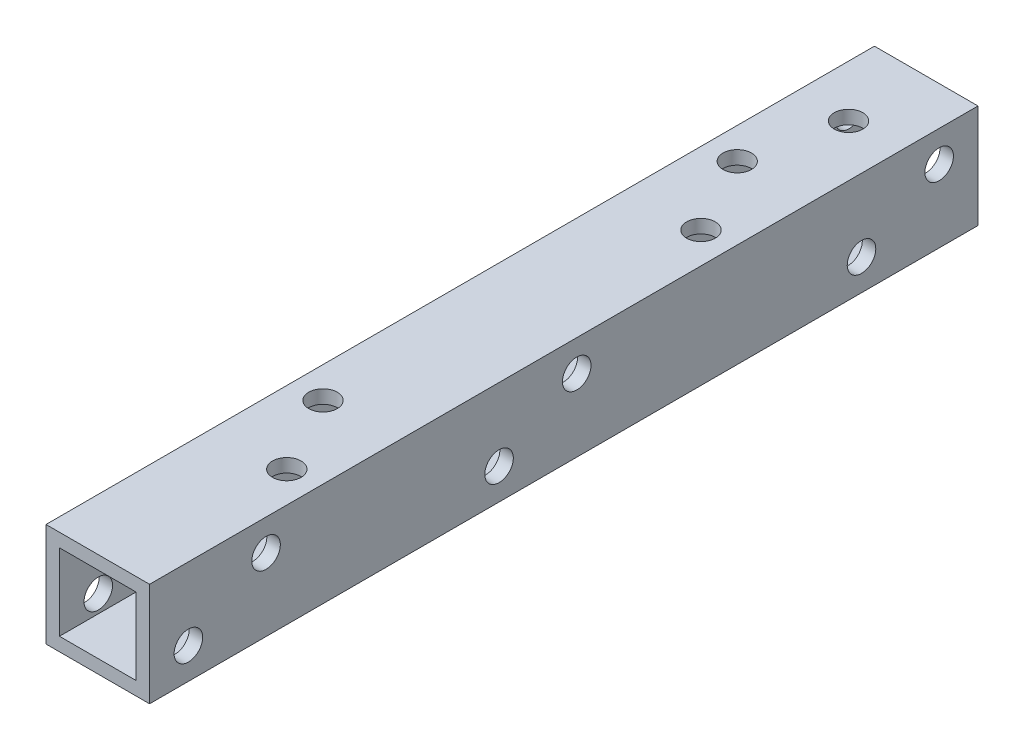
ISO-10303-21;
HEADER;
FILE_DESCRIPTION(('STEP AP214'),'2;1');
FILE_NAME('part.step','',(''),(''),'','','');
FILE_SCHEMA(('AUTOMOTIVE_DESIGN { 1 0 10303 214 1 1 1 1 }'));
ENDSEC;
DATA;
#1=APPLICATION_CONTEXT('core data for automotive mechanical design processes');
#2=APPLICATION_PROTOCOL_DEFINITION('international standard','automotive_design',2000,#1);
#3=PRODUCT_CONTEXT('',#1,'mechanical');
#4=PRODUCT('Part','Part','',(#3));
#5=PRODUCT_RELATED_PRODUCT_CATEGORY('part','',(#4));
#6=PRODUCT_DEFINITION_FORMATION('','',#4);
#7=PRODUCT_DEFINITION_CONTEXT('part definition',#1,'design');
#8=PRODUCT_DEFINITION('design','',#6,#7);
#9=PRODUCT_DEFINITION_SHAPE('','',#8);
#10=(LENGTH_UNIT() NAMED_UNIT(*) SI_UNIT(.MILLI.,.METRE.));
#11=(NAMED_UNIT(*) PLANE_ANGLE_UNIT() SI_UNIT($,.RADIAN.));
#12=(NAMED_UNIT(*) SI_UNIT($,.STERADIAN.) SOLID_ANGLE_UNIT());
#13=UNCERTAINTY_MEASURE_WITH_UNIT(LENGTH_MEASURE(1.E-05),#10,'distance_accuracy_value','');
#14=(GEOMETRIC_REPRESENTATION_CONTEXT(3) GLOBAL_UNCERTAINTY_ASSIGNED_CONTEXT((#13)) GLOBAL_UNIT_ASSIGNED_CONTEXT((#10,
#11,#12)) REPRESENTATION_CONTEXT('',''));
#15=CARTESIAN_POINT('',(0.,0.,0.));
#16=DIRECTION('',(0.,0.,1.));
#17=DIRECTION('',(1.,0.,0.));
#18=AXIS2_PLACEMENT_3D('',#15,#16,#17);
#19=CARTESIAN_POINT('',(0.,0.,101.6));
#20=DIRECTION('',(0.,0.,1.));
#21=DIRECTION('',(1.,0.,0.));
#22=AXIS2_PLACEMENT_3D('',#19,#20,#21);
#23=PLANE('',#22);
#24=DIRECTION('',(1.,0.,0.));
#25=VECTOR('',#24,1.);
#26=CARTESIAN_POINT('',(6.35,-6.35,101.6));
#27=LINE('',#26,#25);
#28=CARTESIAN_POINT('',(-6.35,-6.35,101.6));
#29=VERTEX_POINT('',#28);
#30=CARTESIAN_POINT('',(6.35,-6.35,101.6));
#31=VERTEX_POINT('',#30);
#32=EDGE_CURVE('E146',#29,#31,#27,.T.);
#33=ORIENTED_EDGE('',*,*,#32,.T.);
#34=DIRECTION('',(0.,1.,0.));
#35=VECTOR('',#34,1.);
#36=CARTESIAN_POINT('',(6.35,6.35,101.6));
#37=LINE('',#36,#35);
#38=CARTESIAN_POINT('',(6.35,6.35,101.6));
#39=VERTEX_POINT('',#38);
#40=EDGE_CURVE('E149',#31,#39,#37,.T.);
#41=ORIENTED_EDGE('',*,*,#40,.T.);
#42=DIRECTION('',(-1.,0.,0.));
#43=VECTOR('',#42,1.);
#44=CARTESIAN_POINT('',(6.35,6.35,101.6));
#45=LINE('',#44,#43);
#46=CARTESIAN_POINT('',(-6.35,6.35,101.6));
#47=VERTEX_POINT('',#46);
#48=EDGE_CURVE('E152',#39,#47,#45,.T.);
#49=ORIENTED_EDGE('',*,*,#48,.T.);
#50=DIRECTION('',(0.,-1.,0.));
#51=VECTOR('',#50,1.);
#52=CARTESIAN_POINT('',(-6.35,6.35,101.6));
#53=LINE('',#52,#51);
#54=EDGE_CURVE('E154',#47,#29,#53,.T.);
#55=ORIENTED_EDGE('',*,*,#54,.T.);
#56=EDGE_LOOP('',(#33,#41,#49,#55));
#57=FACE_BOUND('',#56,.T.);
#58=DIRECTION('',(0.,1.,0.));
#59=VECTOR('',#58,1.);
#60=CARTESIAN_POINT('',(4.699,4.699,101.6));
#61=LINE('',#60,#59);
#62=CARTESIAN_POINT('',(4.699,-4.699,101.6));
#63=VERTEX_POINT('',#62);
#64=CARTESIAN_POINT('',(4.699,4.699,101.6));
#65=VERTEX_POINT('',#64);
#66=EDGE_CURVE('E116',#63,#65,#61,.T.);
#67=ORIENTED_EDGE('',*,*,#66,.F.);
#68=DIRECTION('',(1.,0.,0.));
#69=VECTOR('',#68,1.);
#70=CARTESIAN_POINT('',(4.699,-4.699,101.6));
#71=LINE('',#70,#69);
#72=CARTESIAN_POINT('',(-4.699,-4.699,101.6));
#73=VERTEX_POINT('',#72);
#74=EDGE_CURVE('E108',#73,#63,#71,.T.);
#75=ORIENTED_EDGE('',*,*,#74,.F.);
#76=DIRECTION('',(0.,-1.,0.));
#77=VECTOR('',#76,1.);
#78=CARTESIAN_POINT('',(-4.699,4.699,101.6));
#79=LINE('',#78,#77);
#80=CARTESIAN_POINT('',(-4.699,4.699,101.6));
#81=VERTEX_POINT('',#80);
#82=EDGE_CURVE('E130',#81,#73,#79,.T.);
#83=ORIENTED_EDGE('',*,*,#82,.F.);
#84=DIRECTION('',(-1.,0.,0.));
#85=VECTOR('',#84,1.);
#86=CARTESIAN_POINT('',(4.699,4.699,101.6));
#87=LINE('',#86,#85);
#88=EDGE_CURVE('E128',#65,#81,#87,.T.);
#89=ORIENTED_EDGE('',*,*,#88,.F.);
#90=EDGE_LOOP('',(#67,#75,#83,#89));
#91=FACE_BOUND('',#90,.T.);
#92=ADVANCED_FACE('F41',(#57,#91),#23,.T.);
#93=CARTESIAN_POINT('',(0.,0.,0.));
#94=DIRECTION('',(0.,0.,1.));
#95=DIRECTION('',(1.,0.,0.));
#96=AXIS2_PLACEMENT_3D('',#93,#94,#95);
#97=PLANE('',#96);
#98=DIRECTION('',(1.,0.,0.));
#99=VECTOR('',#98,1.);
#100=CARTESIAN_POINT('',(6.35,-6.35,0.));
#101=LINE('',#100,#99);
#102=CARTESIAN_POINT('',(-6.35,-6.35,0.));
#103=VERTEX_POINT('',#102);
#104=CARTESIAN_POINT('',(6.35,-6.35,0.));
#105=VERTEX_POINT('',#104);
#106=EDGE_CURVE('E124',#103,#105,#101,.T.);
#107=ORIENTED_EDGE('',*,*,#106,.F.);
#108=DIRECTION('',(0.,-1.,0.));
#109=VECTOR('',#108,1.);
#110=CARTESIAN_POINT('',(-6.35,6.35,0.));
#111=LINE('',#110,#109);
#112=CARTESIAN_POINT('',(-6.35,6.35,0.));
#113=VERTEX_POINT('',#112);
#114=EDGE_CURVE('E150',#113,#103,#111,.T.);
#115=ORIENTED_EDGE('',*,*,#114,.F.);
#116=DIRECTION('',(-1.,0.,0.));
#117=VECTOR('',#116,1.);
#118=CARTESIAN_POINT('',(6.35,6.35,0.));
#119=LINE('',#118,#117);
#120=CARTESIAN_POINT('',(6.35,6.35,0.));
#121=VERTEX_POINT('',#120);
#122=EDGE_CURVE('E161',#121,#113,#119,.T.);
#123=ORIENTED_EDGE('',*,*,#122,.F.);
#124=DIRECTION('',(0.,1.,0.));
#125=VECTOR('',#124,1.);
#126=CARTESIAN_POINT('',(6.35,6.35,0.));
#127=LINE('',#126,#125);
#128=EDGE_CURVE('E159',#105,#121,#127,.T.);
#129=ORIENTED_EDGE('',*,*,#128,.F.);
#130=EDGE_LOOP('',(#107,#115,#123,#129));
#131=FACE_BOUND('',#130,.T.);
#132=DIRECTION('',(1.,0.,0.));
#133=VECTOR('',#132,1.);
#134=CARTESIAN_POINT('',(4.699,-4.699,0.));
#135=LINE('',#134,#133);
#136=CARTESIAN_POINT('',(-4.699,-4.699,0.));
#137=VERTEX_POINT('',#136);
#138=CARTESIAN_POINT('',(4.699,-4.699,0.));
#139=VERTEX_POINT('',#138);
#140=EDGE_CURVE('E66',#137,#139,#135,.T.);
#141=ORIENTED_EDGE('',*,*,#140,.T.);
#142=DIRECTION('',(0.,1.,0.));
#143=VECTOR('',#142,1.);
#144=CARTESIAN_POINT('',(4.699,4.699,0.));
#145=LINE('',#144,#143);
#146=CARTESIAN_POINT('',(4.699,4.699,0.));
#147=VERTEX_POINT('',#146);
#148=EDGE_CURVE('E123',#139,#147,#145,.T.);
#149=ORIENTED_EDGE('',*,*,#148,.T.);
#150=DIRECTION('',(-1.,0.,0.));
#151=VECTOR('',#150,1.);
#152=CARTESIAN_POINT('',(4.699,4.699,0.));
#153=LINE('',#152,#151);
#154=CARTESIAN_POINT('',(-4.699,4.699,0.));
#155=VERTEX_POINT('',#154);
#156=EDGE_CURVE('E138',#147,#155,#153,.T.);
#157=ORIENTED_EDGE('',*,*,#156,.T.);
#158=DIRECTION('',(0.,-1.,0.));
#159=VECTOR('',#158,1.);
#160=CARTESIAN_POINT('',(-4.699,4.699,0.));
#161=LINE('',#160,#159);
#162=EDGE_CURVE('E117',#155,#137,#161,.T.);
#163=ORIENTED_EDGE('',*,*,#162,.T.);
#164=EDGE_LOOP('',(#141,#149,#157,#163));
#165=FACE_BOUND('',#164,.T.);
#166=ADVANCED_FACE('F288',(#131,#165),#97,.F.);
#167=CARTESIAN_POINT('',(6.35,-6.35,101.6));
#168=DIRECTION('',(0.,1.,0.));
#169=DIRECTION('',(0.,0.,1.));
#170=AXIS2_PLACEMENT_3D('',#167,#168,#169);
#171=PLANE('',#170);
#172=CARTESIAN_POINT('',(0.,-6.35,9.52500000000001));
#173=DIRECTION('',(0.,1.,0.));
#174=DIRECTION('',(0.,0.,1.));
#175=AXIS2_PLACEMENT_3D('',#172,#173,#174);
#176=CIRCLE('',#175,1.75);
#177=CARTESIAN_POINT('',(0.,-6.35,11.275));
#178=VERTEX_POINT('',#177);
#179=EDGE_CURVE('E438',#178,#178,#176,.T.);
#180=ORIENTED_EDGE('',*,*,#179,.T.);
#181=EDGE_LOOP('',(#180));
#182=FACE_BOUND('',#181,.T.);
#183=CARTESIAN_POINT('',(-2.54,-6.35,20.6375));
#184=DIRECTION('',(0.,1.,0.));
#185=DIRECTION('',(0.,0.,1.));
#186=AXIS2_PLACEMENT_3D('',#183,#184,#185);
#187=CIRCLE('',#186,1.75);
#188=CARTESIAN_POINT('',(-2.54,-6.35,22.3875));
#189=VERTEX_POINT('',#188);
#190=EDGE_CURVE('E136',#189,#189,#187,.T.);
#191=ORIENTED_EDGE('',*,*,#190,.T.);
#192=EDGE_LOOP('',(#191));
#193=FACE_BOUND('',#192,.T.);
#194=CARTESIAN_POINT('',(2.54,-6.35,80.9625));
#195=DIRECTION('',(0.,1.,0.));
#196=DIRECTION('',(0.,0.,1.));
#197=AXIS2_PLACEMENT_3D('',#194,#195,#196);
#198=CIRCLE('',#197,1.75);
#199=CARTESIAN_POINT('',(2.54,-6.35,82.7125));
#200=VERTEX_POINT('',#199);
#201=EDGE_CURVE('E190',#200,#200,#198,.T.);
#202=ORIENTED_EDGE('',*,*,#201,.T.);
#203=EDGE_LOOP('',(#202));
#204=FACE_BOUND('',#203,.T.);
#205=CARTESIAN_POINT('',(-2.54,-6.35,71.4375));
#206=DIRECTION('',(0.,1.,0.));
#207=DIRECTION('',(0.,0.,1.));
#208=AXIS2_PLACEMENT_3D('',#205,#206,#207);
#209=CIRCLE('',#208,1.75000000000001);
#210=CARTESIAN_POINT('',(-2.54,-6.35,73.1875));
#211=VERTEX_POINT('',#210);
#212=EDGE_CURVE('E185',#211,#211,#209,.T.);
#213=ORIENTED_EDGE('',*,*,#212,.T.);
#214=EDGE_LOOP('',(#213));
#215=FACE_BOUND('',#214,.T.);
#216=CARTESIAN_POINT('',(2.54,-6.35,30.1625));
#217=DIRECTION('',(0.,1.,0.));
#218=DIRECTION('',(0.,0.,1.));
#219=AXIS2_PLACEMENT_3D('',#216,#217,#218);
#220=CIRCLE('',#219,1.75);
#221=CARTESIAN_POINT('',(2.54,-6.35,31.9125));
#222=VERTEX_POINT('',#221);
#223=EDGE_CURVE('E180',#222,#222,#220,.T.);
#224=ORIENTED_EDGE('',*,*,#223,.T.);
#225=EDGE_LOOP('',(#224));
#226=FACE_BOUND('',#225,.T.);
#227=ORIENTED_EDGE('',*,*,#106,.T.);
#228=DIRECTION('',(0.,0.,-1.));
#229=VECTOR('',#228,1.);
#230=CARTESIAN_POINT('',(6.35,-6.35,101.6));
#231=LINE('',#230,#229);
#232=EDGE_CURVE('E11',#31,#105,#231,.T.);
#233=ORIENTED_EDGE('',*,*,#232,.F.);
#234=ORIENTED_EDGE('',*,*,#32,.F.);
#235=DIRECTION('',(0.,0.,-1.));
#236=VECTOR('',#235,1.);
#237=CARTESIAN_POINT('',(-6.35,-6.35,101.6));
#238=LINE('',#237,#236);
#239=EDGE_CURVE('E156',#29,#103,#238,.T.);
#240=ORIENTED_EDGE('',*,*,#239,.T.);
#241=EDGE_LOOP('',(#227,#233,#234,#240));
#242=FACE_BOUND('',#241,.T.);
#243=ADVANCED_FACE('F43',(#182,#193,#204,#215,#226,#242),#171,.F.);
#244=CARTESIAN_POINT('',(6.35,6.35,101.6));
#245=DIRECTION('',(-1.,0.,0.));
#246=DIRECTION('',(0.,-1.,0.));
#247=AXIS2_PLACEMENT_3D('',#244,#245,#246);
#248=PLANE('',#247);
#249=CARTESIAN_POINT('',(6.35,-2.54,96.8375));
#250=DIRECTION('',(1.,0.,0.));
#251=DIRECTION('',(0.,1.,0.));
#252=AXIS2_PLACEMENT_3D('',#249,#250,#251);
#253=CIRCLE('',#252,1.75000000000001);
#254=CARTESIAN_POINT('',(6.35,-0.789999999999993,96.8375));
#255=VERTEX_POINT('',#254);
#256=EDGE_CURVE('E195',#255,#255,#253,.T.);
#257=ORIENTED_EDGE('',*,*,#256,.F.);
#258=EDGE_LOOP('',(#257));
#259=FACE_BOUND('',#258,.T.);
#260=CARTESIAN_POINT('',(6.35,2.54000000000001,49.2125));
#261=DIRECTION('',(1.,0.,0.));
#262=DIRECTION('',(0.,1.,0.));
#263=AXIS2_PLACEMENT_3D('',#260,#261,#262);
#264=CIRCLE('',#263,1.75000000000001);
#265=CARTESIAN_POINT('',(6.35,4.29000000000001,49.2125));
#266=VERTEX_POINT('',#265);
#267=EDGE_CURVE('E318',#266,#266,#264,.T.);
#268=ORIENTED_EDGE('',*,*,#267,.F.);
#269=EDGE_LOOP('',(#268));
#270=FACE_BOUND('',#269,.T.);
#271=CARTESIAN_POINT('',(6.35,2.54,87.3125));
#272=DIRECTION('',(1.,0.,0.));
#273=DIRECTION('',(0.,1.,0.));
#274=AXIS2_PLACEMENT_3D('',#271,#272,#273);
#275=CIRCLE('',#274,1.75000000000001);
#276=CARTESIAN_POINT('',(6.35,4.29000000000001,87.3125));
#277=VERTEX_POINT('',#276);
#278=EDGE_CURVE('E322',#277,#277,#275,.T.);
#279=ORIENTED_EDGE('',*,*,#278,.F.);
#280=EDGE_LOOP('',(#279));
#281=FACE_BOUND('',#280,.T.);
#282=CARTESIAN_POINT('',(6.35,-2.54,14.2875));
#283=DIRECTION('',(1.,0.,0.));
#284=DIRECTION('',(0.,1.,0.));
#285=AXIS2_PLACEMENT_3D('',#282,#283,#284);
#286=CIRCLE('',#285,1.75000000000001);
#287=CARTESIAN_POINT('',(6.35,-0.789999999999996,14.2875));
#288=VERTEX_POINT('',#287);
#289=EDGE_CURVE('E326',#288,#288,#286,.T.);
#290=ORIENTED_EDGE('',*,*,#289,.F.);
#291=EDGE_LOOP('',(#290));
#292=FACE_BOUND('',#291,.T.);
#293=CARTESIAN_POINT('',(6.35,2.54,4.76250000000001));
#294=DIRECTION('',(1.,0.,0.));
#295=DIRECTION('',(0.,1.,0.));
#296=AXIS2_PLACEMENT_3D('',#293,#294,#295);
#297=CIRCLE('',#296,1.75000000000001);
#298=CARTESIAN_POINT('',(6.35,4.29,4.76250000000001));
#299=VERTEX_POINT('',#298);
#300=EDGE_CURVE('E330',#299,#299,#297,.T.);
#301=ORIENTED_EDGE('',*,*,#300,.F.);
#302=EDGE_LOOP('',(#301));
#303=FACE_BOUND('',#302,.T.);
#304=CARTESIAN_POINT('',(6.35,-2.53999999999999,58.7375));
#305=DIRECTION('',(1.,0.,0.));
#306=DIRECTION('',(0.,1.,0.));
#307=AXIS2_PLACEMENT_3D('',#304,#305,#306);
#308=CIRCLE('',#307,1.75000000000001);
#309=CARTESIAN_POINT('',(6.35,-0.789999999999989,58.7375));
#310=VERTEX_POINT('',#309);
#311=EDGE_CURVE('E334',#310,#310,#308,.T.);
#312=ORIENTED_EDGE('',*,*,#311,.F.);
#313=EDGE_LOOP('',(#312));
#314=FACE_BOUND('',#313,.T.);
#315=ORIENTED_EDGE('',*,*,#128,.T.);
#316=DIRECTION('',(0.,0.,-1.));
#317=VECTOR('',#316,1.);
#318=CARTESIAN_POINT('',(6.35,6.35,101.6));
#319=LINE('',#318,#317);
#320=EDGE_CURVE('E50',#39,#121,#319,.T.);
#321=ORIENTED_EDGE('',*,*,#320,.F.);
#322=ORIENTED_EDGE('',*,*,#40,.F.);
#323=ORIENTED_EDGE('',*,*,#232,.T.);
#324=EDGE_LOOP('',(#315,#321,#322,#323));
#325=FACE_BOUND('',#324,.T.);
#326=ADVANCED_FACE('F305',(#259,#270,#281,#292,#303,#314,#325),#248,.F.);
#327=CARTESIAN_POINT('',(6.35,6.35,101.6));
#328=DIRECTION('',(0.,-1.,0.));
#329=DIRECTION('',(0.,0.,-1.));
#330=AXIS2_PLACEMENT_3D('',#327,#328,#329);
#331=PLANE('',#330);
#332=CARTESIAN_POINT('',(0.,6.35,9.52500000000001));
#333=DIRECTION('',(0.,1.,0.));
#334=DIRECTION('',(0.,0.,1.));
#335=AXIS2_PLACEMENT_3D('',#332,#333,#334);
#336=CIRCLE('',#335,1.75);
#337=CARTESIAN_POINT('',(0.,6.35,11.275));
#338=VERTEX_POINT('',#337);
#339=EDGE_CURVE('E445',#338,#338,#336,.T.);
#340=ORIENTED_EDGE('',*,*,#339,.F.);
#341=EDGE_LOOP('',(#340));
#342=FACE_BOUND('',#341,.T.);
#343=CARTESIAN_POINT('',(-2.54,6.35,20.6375));
#344=DIRECTION('',(0.,1.,0.));
#345=DIRECTION('',(0.,0.,1.));
#346=AXIS2_PLACEMENT_3D('',#343,#344,#345);
#347=CIRCLE('',#346,1.75);
#348=CARTESIAN_POINT('',(-2.54,6.35,22.3875));
#349=VERTEX_POINT('',#348);
#350=EDGE_CURVE('E238',#349,#349,#347,.T.);
#351=ORIENTED_EDGE('',*,*,#350,.F.);
#352=EDGE_LOOP('',(#351));
#353=FACE_BOUND('',#352,.T.);
#354=CARTESIAN_POINT('',(2.54,6.35,80.9625));
#355=DIRECTION('',(0.,1.,0.));
#356=DIRECTION('',(0.,0.,1.));
#357=AXIS2_PLACEMENT_3D('',#354,#355,#356);
#358=CIRCLE('',#357,1.75);
#359=CARTESIAN_POINT('',(2.54,6.35,82.7125));
#360=VERTEX_POINT('',#359);
#361=EDGE_CURVE('E237',#360,#360,#358,.T.);
#362=ORIENTED_EDGE('',*,*,#361,.F.);
#363=EDGE_LOOP('',(#362));
#364=FACE_BOUND('',#363,.T.);
#365=CARTESIAN_POINT('',(-2.54,6.35,71.4375));
#366=DIRECTION('',(0.,1.,0.));
#367=DIRECTION('',(0.,0.,1.));
#368=AXIS2_PLACEMENT_3D('',#365,#366,#367);
#369=CIRCLE('',#368,1.75000000000001);
#370=CARTESIAN_POINT('',(-2.54,6.35,73.1875));
#371=VERTEX_POINT('',#370);
#372=EDGE_CURVE('E234',#371,#371,#369,.T.);
#373=ORIENTED_EDGE('',*,*,#372,.F.);
#374=EDGE_LOOP('',(#373));
#375=FACE_BOUND('',#374,.T.);
#376=CARTESIAN_POINT('',(2.54,6.35,30.1625));
#377=DIRECTION('',(0.,1.,0.));
#378=DIRECTION('',(0.,0.,1.));
#379=AXIS2_PLACEMENT_3D('',#376,#377,#378);
#380=CIRCLE('',#379,1.75);
#381=CARTESIAN_POINT('',(2.54,6.35,31.9125));
#382=VERTEX_POINT('',#381);
#383=EDGE_CURVE('E175',#382,#382,#380,.T.);
#384=ORIENTED_EDGE('',*,*,#383,.F.);
#385=EDGE_LOOP('',(#384));
#386=FACE_BOUND('',#385,.T.);
#387=ORIENTED_EDGE('',*,*,#122,.T.);
#388=DIRECTION('',(0.,0.,-1.));
#389=VECTOR('',#388,1.);
#390=CARTESIAN_POINT('',(-6.35,6.35,101.6));
#391=LINE('',#390,#389);
#392=EDGE_CURVE('E166',#47,#113,#391,.T.);
#393=ORIENTED_EDGE('',*,*,#392,.F.);
#394=ORIENTED_EDGE('',*,*,#48,.F.);
#395=ORIENTED_EDGE('',*,*,#320,.T.);
#396=EDGE_LOOP('',(#387,#393,#394,#395));
#397=FACE_BOUND('',#396,.T.);
#398=ADVANCED_FACE('F302',(#342,#353,#364,#375,#386,#397),#331,.F.);
#399=CARTESIAN_POINT('',(-6.35,6.35,101.6));
#400=DIRECTION('',(1.,0.,0.));
#401=DIRECTION('',(0.,0.,-1.));
#402=AXIS2_PLACEMENT_3D('',#399,#400,#401);
#403=PLANE('',#402);
#404=CARTESIAN_POINT('',(-6.35,-2.54,96.8375));
#405=DIRECTION('',(1.,0.,0.));
#406=DIRECTION('',(0.,0.,-1.));
#407=AXIS2_PLACEMENT_3D('',#404,#405,#406);
#408=CIRCLE('',#407,1.75000000000001);
#409=CARTESIAN_POINT('',(-6.35,-2.54,95.0875));
#410=VERTEX_POINT('',#409);
#411=EDGE_CURVE('E222',#410,#410,#408,.T.);
#412=ORIENTED_EDGE('',*,*,#411,.T.);
#413=EDGE_LOOP('',(#412));
#414=FACE_BOUND('',#413,.T.);
#415=CARTESIAN_POINT('',(-6.35,2.54,49.2125));
#416=DIRECTION('',(1.,0.,0.));
#417=DIRECTION('',(0.,0.,-1.));
#418=AXIS2_PLACEMENT_3D('',#415,#416,#417);
#419=CIRCLE('',#418,1.75000000000001);
#420=CARTESIAN_POINT('',(-6.35,2.54,47.4625));
#421=VERTEX_POINT('',#420);
#422=EDGE_CURVE('E218',#421,#421,#419,.T.);
#423=ORIENTED_EDGE('',*,*,#422,.T.);
#424=EDGE_LOOP('',(#423));
#425=FACE_BOUND('',#424,.T.);
#426=CARTESIAN_POINT('',(-6.35,2.54,87.3125));
#427=DIRECTION('',(1.,0.,0.));
#428=DIRECTION('',(0.,0.,-1.));
#429=AXIS2_PLACEMENT_3D('',#426,#427,#428);
#430=CIRCLE('',#429,1.75000000000001);
#431=CARTESIAN_POINT('',(-6.35,2.54,85.5625));
#432=VERTEX_POINT('',#431);
#433=EDGE_CURVE('E214',#432,#432,#430,.T.);
#434=ORIENTED_EDGE('',*,*,#433,.T.);
#435=EDGE_LOOP('',(#434));
#436=FACE_BOUND('',#435,.T.);
#437=CARTESIAN_POINT('',(-6.35,-2.54,14.2875));
#438=DIRECTION('',(1.,0.,0.));
#439=DIRECTION('',(0.,0.,-1.));
#440=AXIS2_PLACEMENT_3D('',#437,#438,#439);
#441=CIRCLE('',#440,1.75000000000001);
#442=CARTESIAN_POINT('',(-6.35,-2.54,12.5375));
#443=VERTEX_POINT('',#442);
#444=EDGE_CURVE('E210',#443,#443,#441,.T.);
#445=ORIENTED_EDGE('',*,*,#444,.T.);
#446=EDGE_LOOP('',(#445));
#447=FACE_BOUND('',#446,.T.);
#448=CARTESIAN_POINT('',(-6.35,2.54,4.76250000000001));
#449=DIRECTION('',(1.,0.,0.));
#450=DIRECTION('',(0.,0.,-1.));
#451=AXIS2_PLACEMENT_3D('',#448,#449,#450);
#452=CIRCLE('',#451,1.75000000000001);
#453=CARTESIAN_POINT('',(-6.35,2.54,3.0125));
#454=VERTEX_POINT('',#453);
#455=EDGE_CURVE('E205',#454,#454,#452,.T.);
#456=ORIENTED_EDGE('',*,*,#455,.T.);
#457=EDGE_LOOP('',(#456));
#458=FACE_BOUND('',#457,.T.);
#459=CARTESIAN_POINT('',(-6.35,-2.54,58.7375));
#460=DIRECTION('',(1.,0.,0.));
#461=DIRECTION('',(0.,0.,-1.));
#462=AXIS2_PLACEMENT_3D('',#459,#460,#461);
#463=CIRCLE('',#462,1.75000000000001);
#464=CARTESIAN_POINT('',(-6.35,-2.54,56.9875));
#465=VERTEX_POINT('',#464);
#466=EDGE_CURVE('E200',#465,#465,#463,.T.);
#467=ORIENTED_EDGE('',*,*,#466,.T.);
#468=EDGE_LOOP('',(#467));
#469=FACE_BOUND('',#468,.T.);
#470=ORIENTED_EDGE('',*,*,#114,.T.);
#471=ORIENTED_EDGE('',*,*,#239,.F.);
#472=ORIENTED_EDGE('',*,*,#54,.F.);
#473=ORIENTED_EDGE('',*,*,#392,.T.);
#474=EDGE_LOOP('',(#470,#471,#472,#473));
#475=FACE_BOUND('',#474,.T.);
#476=ADVANCED_FACE('F299',(#414,#425,#436,#447,#458,#469,#475),#403,.F.);
#477=CARTESIAN_POINT('',(4.699,-4.699,101.6));
#478=DIRECTION('',(0.,1.,0.));
#479=DIRECTION('',(0.,0.,1.));
#480=AXIS2_PLACEMENT_3D('',#477,#478,#479);
#481=PLANE('',#480);
#482=CARTESIAN_POINT('',(0.,-4.699,9.52500000000001));
#483=DIRECTION('',(0.,1.,0.));
#484=DIRECTION('',(0.,0.,1.));
#485=AXIS2_PLACEMENT_3D('',#482,#483,#484);
#486=CIRCLE('',#485,1.75);
#487=CARTESIAN_POINT('',(0.,-4.699,11.275));
#488=VERTEX_POINT('',#487);
#489=EDGE_CURVE('E442',#488,#488,#486,.T.);
#490=ORIENTED_EDGE('',*,*,#489,.F.);
#491=EDGE_LOOP('',(#490));
#492=FACE_BOUND('',#491,.T.);
#493=CARTESIAN_POINT('',(-2.54,-4.699,20.6375));
#494=DIRECTION('',(0.,1.,0.));
#495=DIRECTION('',(0.,0.,1.));
#496=AXIS2_PLACEMENT_3D('',#493,#494,#495);
#497=CIRCLE('',#496,1.75);
#498=CARTESIAN_POINT('',(-2.54,-4.699,22.3875));
#499=VERTEX_POINT('',#498);
#500=EDGE_CURVE('E189',#499,#499,#497,.T.);
#501=ORIENTED_EDGE('',*,*,#500,.F.);
#502=EDGE_LOOP('',(#501));
#503=FACE_BOUND('',#502,.T.);
#504=CARTESIAN_POINT('',(2.54,-4.699,80.9625));
#505=DIRECTION('',(0.,1.,0.));
#506=DIRECTION('',(0.,0.,1.));
#507=AXIS2_PLACEMENT_3D('',#504,#505,#506);
#508=CIRCLE('',#507,1.75);
#509=CARTESIAN_POINT('',(2.54,-4.699,82.7125));
#510=VERTEX_POINT('',#509);
#511=EDGE_CURVE('E184',#510,#510,#508,.T.);
#512=ORIENTED_EDGE('',*,*,#511,.F.);
#513=EDGE_LOOP('',(#512));
#514=FACE_BOUND('',#513,.T.);
#515=CARTESIAN_POINT('',(-2.54,-4.699,71.4375));
#516=DIRECTION('',(0.,1.,0.));
#517=DIRECTION('',(0.,0.,1.));
#518=AXIS2_PLACEMENT_3D('',#515,#516,#517);
#519=CIRCLE('',#518,1.75000000000001);
#520=CARTESIAN_POINT('',(-2.54,-4.699,73.1875));
#521=VERTEX_POINT('',#520);
#522=EDGE_CURVE('E179',#521,#521,#519,.T.);
#523=ORIENTED_EDGE('',*,*,#522,.F.);
#524=EDGE_LOOP('',(#523));
#525=FACE_BOUND('',#524,.T.);
#526=CARTESIAN_POINT('',(2.54,-4.699,30.1625));
#527=DIRECTION('',(0.,1.,0.));
#528=DIRECTION('',(0.,0.,1.));
#529=AXIS2_PLACEMENT_3D('',#526,#527,#528);
#530=CIRCLE('',#529,1.75);
#531=CARTESIAN_POINT('',(2.54,-4.699,31.9125));
#532=VERTEX_POINT('',#531);
#533=EDGE_CURVE('E174',#532,#532,#530,.T.);
#534=ORIENTED_EDGE('',*,*,#533,.F.);
#535=EDGE_LOOP('',(#534));
#536=FACE_BOUND('',#535,.T.);
#537=ORIENTED_EDGE('',*,*,#140,.F.);
#538=DIRECTION('',(0.,0.,-1.));
#539=VECTOR('',#538,1.);
#540=CARTESIAN_POINT('',(-4.699,-4.699,101.6));
#541=LINE('',#540,#539);
#542=EDGE_CURVE('E112',#73,#137,#541,.T.);
#543=ORIENTED_EDGE('',*,*,#542,.F.);
#544=ORIENTED_EDGE('',*,*,#74,.T.);
#545=DIRECTION('',(0.,0.,-1.));
#546=VECTOR('',#545,1.);
#547=CARTESIAN_POINT('',(4.699,-4.699,101.6));
#548=LINE('',#547,#546);
#549=EDGE_CURVE('E111',#63,#139,#548,.T.);
#550=ORIENTED_EDGE('',*,*,#549,.T.);
#551=EDGE_LOOP('',(#537,#543,#544,#550));
#552=FACE_BOUND('',#551,.T.);
#553=ADVANCED_FACE('F110',(#492,#503,#514,#525,#536,#552),#481,.T.);
#554=CARTESIAN_POINT('',(4.699,4.699,101.6));
#555=DIRECTION('',(-1.,0.,0.));
#556=DIRECTION('',(0.,0.,1.));
#557=AXIS2_PLACEMENT_3D('',#554,#555,#556);
#558=PLANE('',#557);
#559=CARTESIAN_POINT('',(4.69899999999999,-2.54,96.8375));
#560=DIRECTION('',(-1.,0.,0.));
#561=DIRECTION('',(0.,0.,1.));
#562=AXIS2_PLACEMENT_3D('',#559,#560,#561);
#563=CIRCLE('',#562,1.75000000000001);
#564=CARTESIAN_POINT('',(4.69899999999999,-2.54,98.5875));
#565=VERTEX_POINT('',#564);
#566=EDGE_CURVE('E217',#565,#565,#563,.T.);
#567=ORIENTED_EDGE('',*,*,#566,.F.);
#568=EDGE_LOOP('',(#567));
#569=FACE_BOUND('',#568,.T.);
#570=CARTESIAN_POINT('',(4.69899999999999,2.54000000000001,49.2125));
#571=DIRECTION('',(-1.,0.,0.));
#572=DIRECTION('',(0.,0.,1.));
#573=AXIS2_PLACEMENT_3D('',#570,#571,#572);
#574=CIRCLE('',#573,1.75000000000001);
#575=CARTESIAN_POINT('',(4.69899999999999,2.54000000000001,50.9625));
#576=VERTEX_POINT('',#575);
#577=EDGE_CURVE('E213',#576,#576,#574,.T.);
#578=ORIENTED_EDGE('',*,*,#577,.F.);
#579=EDGE_LOOP('',(#578));
#580=FACE_BOUND('',#579,.T.);
#581=CARTESIAN_POINT('',(4.69899999999999,2.54,87.3125));
#582=DIRECTION('',(-1.,0.,0.));
#583=DIRECTION('',(0.,0.,1.));
#584=AXIS2_PLACEMENT_3D('',#581,#582,#583);
#585=CIRCLE('',#584,1.75000000000001);
#586=CARTESIAN_POINT('',(4.69899999999999,2.54,89.0625));
#587=VERTEX_POINT('',#586);
#588=EDGE_CURVE('E209',#587,#587,#585,.T.);
#589=ORIENTED_EDGE('',*,*,#588,.F.);
#590=EDGE_LOOP('',(#589));
#591=FACE_BOUND('',#590,.T.);
#592=CARTESIAN_POINT('',(4.69899999999999,-2.54,14.2875));
#593=DIRECTION('',(-1.,0.,0.));
#594=DIRECTION('',(0.,0.,1.));
#595=AXIS2_PLACEMENT_3D('',#592,#593,#594);
#596=CIRCLE('',#595,1.75000000000001);
#597=CARTESIAN_POINT('',(4.69899999999999,-2.54,16.0375));
#598=VERTEX_POINT('',#597);
#599=EDGE_CURVE('E204',#598,#598,#596,.T.);
#600=ORIENTED_EDGE('',*,*,#599,.F.);
#601=EDGE_LOOP('',(#600));
#602=FACE_BOUND('',#601,.T.);
#603=CARTESIAN_POINT('',(4.69899999999999,2.54,4.76250000000001));
#604=DIRECTION('',(-1.,0.,0.));
#605=DIRECTION('',(0.,0.,1.));
#606=AXIS2_PLACEMENT_3D('',#603,#604,#605);
#607=CIRCLE('',#606,1.75000000000001);
#608=CARTESIAN_POINT('',(4.69899999999999,2.54,6.51250000000001));
#609=VERTEX_POINT('',#608);
#610=EDGE_CURVE('E199',#609,#609,#607,.T.);
#611=ORIENTED_EDGE('',*,*,#610,.F.);
#612=EDGE_LOOP('',(#611));
#613=FACE_BOUND('',#612,.T.);
#614=CARTESIAN_POINT('',(4.69899999999999,-2.53999999999999,58.7375));
#615=DIRECTION('',(-1.,0.,0.));
#616=DIRECTION('',(0.,0.,1.));
#617=AXIS2_PLACEMENT_3D('',#614,#615,#616);
#618=CIRCLE('',#617,1.75000000000001);
#619=CARTESIAN_POINT('',(4.69899999999999,-2.53999999999999,60.4875));
#620=VERTEX_POINT('',#619);
#621=EDGE_CURVE('E194',#620,#620,#618,.T.);
#622=ORIENTED_EDGE('',*,*,#621,.F.);
#623=EDGE_LOOP('',(#622));
#624=FACE_BOUND('',#623,.T.);
#625=ORIENTED_EDGE('',*,*,#148,.F.);
#626=ORIENTED_EDGE('',*,*,#549,.F.);
#627=ORIENTED_EDGE('',*,*,#66,.T.);
#628=DIRECTION('',(0.,0.,-1.));
#629=VECTOR('',#628,1.);
#630=CARTESIAN_POINT('',(4.699,4.699,101.6));
#631=LINE('',#630,#629);
#632=EDGE_CURVE('E125',#65,#147,#631,.T.);
#633=ORIENTED_EDGE('',*,*,#632,.T.);
#634=EDGE_LOOP('',(#625,#626,#627,#633));
#635=FACE_BOUND('',#634,.T.);
#636=ADVANCED_FACE('F120',(#569,#580,#591,#602,#613,#624,#635),#558,.T.);
#637=CARTESIAN_POINT('',(4.699,4.699,101.6));
#638=DIRECTION('',(0.,-1.,0.));
#639=DIRECTION('',(0.,0.,-1.));
#640=AXIS2_PLACEMENT_3D('',#637,#638,#639);
#641=PLANE('',#640);
#642=CARTESIAN_POINT('',(0.,4.699,9.52500000000001));
#643=DIRECTION('',(0.,-1.,0.));
#644=DIRECTION('',(0.,0.,-1.));
#645=AXIS2_PLACEMENT_3D('',#642,#643,#644);
#646=CIRCLE('',#645,1.75);
#647=CARTESIAN_POINT('',(0.,4.699,7.77500000000001));
#648=VERTEX_POINT('',#647);
#649=EDGE_CURVE('E45',#648,#648,#646,.T.);
#650=ORIENTED_EDGE('',*,*,#649,.F.);
#651=EDGE_LOOP('',(#650));
#652=FACE_BOUND('',#651,.T.);
#653=CARTESIAN_POINT('',(-2.54,4.699,20.6375));
#654=DIRECTION('',(0.,-1.,0.));
#655=DIRECTION('',(0.,0.,-1.));
#656=AXIS2_PLACEMENT_3D('',#653,#654,#655);
#657=CIRCLE('',#656,1.75);
#658=CARTESIAN_POINT('',(-2.54,4.699,18.8875));
#659=VERTEX_POINT('',#658);
#660=EDGE_CURVE('E186',#659,#659,#657,.T.);
#661=ORIENTED_EDGE('',*,*,#660,.F.);
#662=EDGE_LOOP('',(#661));
#663=FACE_BOUND('',#662,.T.);
#664=CARTESIAN_POINT('',(2.54,4.699,80.9625));
#665=DIRECTION('',(0.,-1.,0.));
#666=DIRECTION('',(0.,0.,-1.));
#667=AXIS2_PLACEMENT_3D('',#664,#665,#666);
#668=CIRCLE('',#667,1.75);
#669=CARTESIAN_POINT('',(2.54,4.699,79.2125));
#670=VERTEX_POINT('',#669);
#671=EDGE_CURVE('E181',#670,#670,#668,.T.);
#672=ORIENTED_EDGE('',*,*,#671,.F.);
#673=EDGE_LOOP('',(#672));
#674=FACE_BOUND('',#673,.T.);
#675=CARTESIAN_POINT('',(-2.54,4.699,71.4375));
#676=DIRECTION('',(0.,-1.,0.));
#677=DIRECTION('',(0.,0.,-1.));
#678=AXIS2_PLACEMENT_3D('',#675,#676,#677);
#679=CIRCLE('',#678,1.75000000000001);
#680=CARTESIAN_POINT('',(-2.54,4.699,69.6875));
#681=VERTEX_POINT('',#680);
#682=EDGE_CURVE('E176',#681,#681,#679,.T.);
#683=ORIENTED_EDGE('',*,*,#682,.F.);
#684=EDGE_LOOP('',(#683));
#685=FACE_BOUND('',#684,.T.);
#686=CARTESIAN_POINT('',(2.54,4.699,30.1625));
#687=DIRECTION('',(0.,-1.,0.));
#688=DIRECTION('',(0.,0.,-1.));
#689=AXIS2_PLACEMENT_3D('',#686,#687,#688);
#690=CIRCLE('',#689,1.75);
#691=CARTESIAN_POINT('',(2.54,4.699,28.4125));
#692=VERTEX_POINT('',#691);
#693=EDGE_CURVE('E171',#692,#692,#690,.T.);
#694=ORIENTED_EDGE('',*,*,#693,.F.);
#695=EDGE_LOOP('',(#694));
#696=FACE_BOUND('',#695,.T.);
#697=ORIENTED_EDGE('',*,*,#156,.F.);
#698=ORIENTED_EDGE('',*,*,#632,.F.);
#699=ORIENTED_EDGE('',*,*,#88,.T.);
#700=DIRECTION('',(0.,0.,-1.));
#701=VECTOR('',#700,1.);
#702=CARTESIAN_POINT('',(-4.699,4.699,101.6));
#703=LINE('',#702,#701);
#704=EDGE_CURVE('E58',#81,#155,#703,.T.);
#705=ORIENTED_EDGE('',*,*,#704,.T.);
#706=EDGE_LOOP('',(#697,#698,#699,#705));
#707=FACE_BOUND('',#706,.T.);
#708=ADVANCED_FACE('F353',(#652,#663,#674,#685,#696,#707),#641,.T.);
#709=CARTESIAN_POINT('',(-4.699,4.699,101.6));
#710=DIRECTION('',(1.,0.,0.));
#711=DIRECTION('',(0.,0.,-1.));
#712=AXIS2_PLACEMENT_3D('',#709,#710,#711);
#713=PLANE('',#712);
#714=CARTESIAN_POINT('',(-4.699,-2.54,96.8375));
#715=DIRECTION('',(1.,0.,0.));
#716=DIRECTION('',(0.,0.,-1.));
#717=AXIS2_PLACEMENT_3D('',#714,#715,#716);
#718=CIRCLE('',#717,1.75000000000001);
#719=CARTESIAN_POINT('',(-4.699,-2.54,95.0875));
#720=VERTEX_POINT('',#719);
#721=EDGE_CURVE('E215',#720,#720,#718,.T.);
#722=ORIENTED_EDGE('',*,*,#721,.F.);
#723=EDGE_LOOP('',(#722));
#724=FACE_BOUND('',#723,.T.);
#725=CARTESIAN_POINT('',(-4.699,2.54,49.2125));
#726=DIRECTION('',(1.,0.,0.));
#727=DIRECTION('',(0.,0.,-1.));
#728=AXIS2_PLACEMENT_3D('',#725,#726,#727);
#729=CIRCLE('',#728,1.75000000000001);
#730=CARTESIAN_POINT('',(-4.699,2.54,47.4625));
#731=VERTEX_POINT('',#730);
#732=EDGE_CURVE('E211',#731,#731,#729,.T.);
#733=ORIENTED_EDGE('',*,*,#732,.F.);
#734=EDGE_LOOP('',(#733));
#735=FACE_BOUND('',#734,.T.);
#736=CARTESIAN_POINT('',(-4.699,2.54,87.3125));
#737=DIRECTION('',(1.,0.,0.));
#738=DIRECTION('',(0.,0.,-1.));
#739=AXIS2_PLACEMENT_3D('',#736,#737,#738);
#740=CIRCLE('',#739,1.75000000000001);
#741=CARTESIAN_POINT('',(-4.699,2.54,85.5625));
#742=VERTEX_POINT('',#741);
#743=EDGE_CURVE('E206',#742,#742,#740,.T.);
#744=ORIENTED_EDGE('',*,*,#743,.F.);
#745=EDGE_LOOP('',(#744));
#746=FACE_BOUND('',#745,.T.);
#747=CARTESIAN_POINT('',(-4.699,-2.54,14.2875));
#748=DIRECTION('',(1.,0.,0.));
#749=DIRECTION('',(0.,0.,-1.));
#750=AXIS2_PLACEMENT_3D('',#747,#748,#749);
#751=CIRCLE('',#750,1.75000000000001);
#752=CARTESIAN_POINT('',(-4.699,-2.54,12.5375));
#753=VERTEX_POINT('',#752);
#754=EDGE_CURVE('E201',#753,#753,#751,.T.);
#755=ORIENTED_EDGE('',*,*,#754,.F.);
#756=EDGE_LOOP('',(#755));
#757=FACE_BOUND('',#756,.T.);
#758=CARTESIAN_POINT('',(-4.699,2.54,4.76250000000001));
#759=DIRECTION('',(1.,0.,0.));
#760=DIRECTION('',(0.,0.,-1.));
#761=AXIS2_PLACEMENT_3D('',#758,#759,#760);
#762=CIRCLE('',#761,1.75000000000001);
#763=CARTESIAN_POINT('',(-4.699,2.54,3.0125));
#764=VERTEX_POINT('',#763);
#765=EDGE_CURVE('E196',#764,#764,#762,.T.);
#766=ORIENTED_EDGE('',*,*,#765,.F.);
#767=EDGE_LOOP('',(#766));
#768=FACE_BOUND('',#767,.T.);
#769=CARTESIAN_POINT('',(-4.699,-2.54,58.7375));
#770=DIRECTION('',(1.,0.,0.));
#771=DIRECTION('',(0.,0.,-1.));
#772=AXIS2_PLACEMENT_3D('',#769,#770,#771);
#773=CIRCLE('',#772,1.75000000000001);
#774=CARTESIAN_POINT('',(-4.699,-2.54,56.9875));
#775=VERTEX_POINT('',#774);
#776=EDGE_CURVE('E191',#775,#775,#773,.T.);
#777=ORIENTED_EDGE('',*,*,#776,.F.);
#778=EDGE_LOOP('',(#777));
#779=FACE_BOUND('',#778,.T.);
#780=ORIENTED_EDGE('',*,*,#162,.F.);
#781=ORIENTED_EDGE('',*,*,#704,.F.);
#782=ORIENTED_EDGE('',*,*,#82,.T.);
#783=ORIENTED_EDGE('',*,*,#542,.T.);
#784=EDGE_LOOP('',(#780,#781,#782,#783));
#785=FACE_BOUND('',#784,.T.);
#786=ADVANCED_FACE('F350',(#724,#735,#746,#757,#768,#779,#785),#713,.T.);
#787=CARTESIAN_POINT('',(2.54,-15.9385,30.1625));
#788=DIRECTION('',(0.,1.,0.));
#789=DIRECTION('',(0.,0.,1.));
#790=AXIS2_PLACEMENT_3D('',#787,#788,#789);
#791=CYLINDRICAL_SURFACE('',#790,1.75);
#792=ORIENTED_EDGE('',*,*,#693,.T.);
#793=EDGE_LOOP('',(#792));
#794=FACE_BOUND('',#793,.T.);
#795=ORIENTED_EDGE('',*,*,#383,.T.);
#796=EDGE_LOOP('',(#795));
#797=FACE_BOUND('',#796,.T.);
#798=ADVANCED_FACE('F352',(#794,#797),#791,.F.);
#799=CARTESIAN_POINT('',(-2.54,-15.9385,71.4375));
#800=DIRECTION('',(0.,1.,0.));
#801=DIRECTION('',(0.,0.,1.));
#802=AXIS2_PLACEMENT_3D('',#799,#800,#801);
#803=CYLINDRICAL_SURFACE('',#802,1.75000000000001);
#804=ORIENTED_EDGE('',*,*,#682,.T.);
#805=EDGE_LOOP('',(#804));
#806=FACE_BOUND('',#805,.T.);
#807=ORIENTED_EDGE('',*,*,#372,.T.);
#808=EDGE_LOOP('',(#807));
#809=FACE_BOUND('',#808,.T.);
#810=ADVANCED_FACE('F360',(#806,#809),#803,.F.);
#811=CARTESIAN_POINT('',(2.54,-15.9385,80.9625));
#812=DIRECTION('',(0.,1.,0.));
#813=DIRECTION('',(0.,0.,1.));
#814=AXIS2_PLACEMENT_3D('',#811,#812,#813);
#815=CYLINDRICAL_SURFACE('',#814,1.75);
#816=ORIENTED_EDGE('',*,*,#671,.T.);
#817=EDGE_LOOP('',(#816));
#818=FACE_BOUND('',#817,.T.);
#819=ORIENTED_EDGE('',*,*,#361,.T.);
#820=EDGE_LOOP('',(#819));
#821=FACE_BOUND('',#820,.T.);
#822=ADVANCED_FACE('F282',(#818,#821),#815,.F.);
#823=CARTESIAN_POINT('',(-2.54,-15.9385,20.6375));
#824=DIRECTION('',(0.,1.,0.));
#825=DIRECTION('',(0.,0.,1.));
#826=AXIS2_PLACEMENT_3D('',#823,#824,#825);
#827=CYLINDRICAL_SURFACE('',#826,1.75);
#828=ORIENTED_EDGE('',*,*,#660,.T.);
#829=EDGE_LOOP('',(#828));
#830=FACE_BOUND('',#829,.T.);
#831=ORIENTED_EDGE('',*,*,#350,.T.);
#832=EDGE_LOOP('',(#831));
#833=FACE_BOUND('',#832,.T.);
#834=ADVANCED_FACE('F269',(#830,#833),#827,.F.);
#835=ORIENTED_EDGE('',*,*,#533,.T.);
#836=EDGE_LOOP('',(#835));
#837=FACE_BOUND('',#836,.T.);
#838=ORIENTED_EDGE('',*,*,#223,.F.);
#839=EDGE_LOOP('',(#838));
#840=FACE_BOUND('',#839,.T.);
#841=ADVANCED_FACE('F285',(#837,#840),#791,.F.);
#842=ORIENTED_EDGE('',*,*,#522,.T.);
#843=EDGE_LOOP('',(#842));
#844=FACE_BOUND('',#843,.T.);
#845=ORIENTED_EDGE('',*,*,#212,.F.);
#846=EDGE_LOOP('',(#845));
#847=FACE_BOUND('',#846,.T.);
#848=ADVANCED_FACE('F279',(#844,#847),#803,.F.);
#849=ORIENTED_EDGE('',*,*,#511,.T.);
#850=EDGE_LOOP('',(#849));
#851=FACE_BOUND('',#850,.T.);
#852=ORIENTED_EDGE('',*,*,#201,.F.);
#853=EDGE_LOOP('',(#852));
#854=FACE_BOUND('',#853,.T.);
#855=ADVANCED_FACE('F266',(#851,#854),#815,.F.);
#856=ORIENTED_EDGE('',*,*,#500,.T.);
#857=EDGE_LOOP('',(#856));
#858=FACE_BOUND('',#857,.T.);
#859=ORIENTED_EDGE('',*,*,#190,.F.);
#860=EDGE_LOOP('',(#859));
#861=FACE_BOUND('',#860,.T.);
#862=ADVANCED_FACE('F263',(#858,#861),#827,.F.);
#863=CARTESIAN_POINT('',(-15.748,-2.54,58.7375));
#864=DIRECTION('',(1.,0.,0.));
#865=DIRECTION('',(0.,1.,0.));
#866=AXIS2_PLACEMENT_3D('',#863,#864,#865);
#867=CYLINDRICAL_SURFACE('',#866,1.75000000000001);
#868=ORIENTED_EDGE('',*,*,#776,.T.);
#869=EDGE_LOOP('',(#868));
#870=FACE_BOUND('',#869,.T.);
#871=ORIENTED_EDGE('',*,*,#466,.F.);
#872=EDGE_LOOP('',(#871));
#873=FACE_BOUND('',#872,.T.);
#874=ADVANCED_FACE('F265',(#870,#873),#867,.F.);
#875=CARTESIAN_POINT('',(-15.748,2.53999999999999,4.76250000000001));
#876=DIRECTION('',(1.,0.,0.));
#877=DIRECTION('',(0.,1.,0.));
#878=AXIS2_PLACEMENT_3D('',#875,#876,#877);
#879=CYLINDRICAL_SURFACE('',#878,1.75000000000001);
#880=ORIENTED_EDGE('',*,*,#765,.T.);
#881=EDGE_LOOP('',(#880));
#882=FACE_BOUND('',#881,.T.);
#883=ORIENTED_EDGE('',*,*,#455,.F.);
#884=EDGE_LOOP('',(#883));
#885=FACE_BOUND('',#884,.T.);
#886=ADVANCED_FACE('F275',(#882,#885),#879,.F.);
#887=CARTESIAN_POINT('',(-15.748,-2.54000000000001,14.2875));
#888=DIRECTION('',(1.,0.,0.));
#889=DIRECTION('',(0.,1.,0.));
#890=AXIS2_PLACEMENT_3D('',#887,#888,#889);
#891=CYLINDRICAL_SURFACE('',#890,1.75000000000001);
#892=ORIENTED_EDGE('',*,*,#754,.T.);
#893=EDGE_LOOP('',(#892));
#894=FACE_BOUND('',#893,.T.);
#895=ORIENTED_EDGE('',*,*,#444,.F.);
#896=EDGE_LOOP('',(#895));
#897=FACE_BOUND('',#896,.T.);
#898=ADVANCED_FACE('F408',(#894,#897),#891,.F.);
#899=CARTESIAN_POINT('',(-15.748,2.54,87.3125));
#900=DIRECTION('',(1.,0.,0.));
#901=DIRECTION('',(0.,1.,0.));
#902=AXIS2_PLACEMENT_3D('',#899,#900,#901);
#903=CYLINDRICAL_SURFACE('',#902,1.75000000000001);
#904=ORIENTED_EDGE('',*,*,#743,.T.);
#905=EDGE_LOOP('',(#904));
#906=FACE_BOUND('',#905,.T.);
#907=ORIENTED_EDGE('',*,*,#433,.F.);
#908=EDGE_LOOP('',(#907));
#909=FACE_BOUND('',#908,.T.);
#910=ADVANCED_FACE('F405',(#906,#909),#903,.F.);
#911=CARTESIAN_POINT('',(-15.748,2.54,49.2125));
#912=DIRECTION('',(1.,0.,0.));
#913=DIRECTION('',(0.,1.,0.));
#914=AXIS2_PLACEMENT_3D('',#911,#912,#913);
#915=CYLINDRICAL_SURFACE('',#914,1.75000000000001);
#916=ORIENTED_EDGE('',*,*,#732,.T.);
#917=EDGE_LOOP('',(#916));
#918=FACE_BOUND('',#917,.T.);
#919=ORIENTED_EDGE('',*,*,#422,.F.);
#920=EDGE_LOOP('',(#919));
#921=FACE_BOUND('',#920,.T.);
#922=ADVANCED_FACE('F407',(#918,#921),#915,.F.);
#923=CARTESIAN_POINT('',(-15.748,-2.54,96.8375));
#924=DIRECTION('',(1.,0.,0.));
#925=DIRECTION('',(0.,1.,0.));
#926=AXIS2_PLACEMENT_3D('',#923,#924,#925);
#927=CYLINDRICAL_SURFACE('',#926,1.75000000000001);
#928=ORIENTED_EDGE('',*,*,#721,.T.);
#929=EDGE_LOOP('',(#928));
#930=FACE_BOUND('',#929,.T.);
#931=ORIENTED_EDGE('',*,*,#411,.F.);
#932=EDGE_LOOP('',(#931));
#933=FACE_BOUND('',#932,.T.);
#934=ADVANCED_FACE('F416',(#930,#933),#927,.F.);
#935=ORIENTED_EDGE('',*,*,#621,.T.);
#936=EDGE_LOOP('',(#935));
#937=FACE_BOUND('',#936,.T.);
#938=ORIENTED_EDGE('',*,*,#311,.T.);
#939=EDGE_LOOP('',(#938));
#940=FACE_BOUND('',#939,.T.);
#941=ADVANCED_FACE('F278',(#937,#940),#867,.F.);
#942=ORIENTED_EDGE('',*,*,#610,.T.);
#943=EDGE_LOOP('',(#942));
#944=FACE_BOUND('',#943,.T.);
#945=ORIENTED_EDGE('',*,*,#300,.T.);
#946=EDGE_LOOP('',(#945));
#947=FACE_BOUND('',#946,.T.);
#948=ADVANCED_FACE('F431',(#944,#947),#879,.F.);
#949=ORIENTED_EDGE('',*,*,#599,.T.);
#950=EDGE_LOOP('',(#949));
#951=FACE_BOUND('',#950,.T.);
#952=ORIENTED_EDGE('',*,*,#289,.T.);
#953=EDGE_LOOP('',(#952));
#954=FACE_BOUND('',#953,.T.);
#955=ADVANCED_FACE('F422',(#951,#954),#891,.F.);
#956=ORIENTED_EDGE('',*,*,#588,.T.);
#957=EDGE_LOOP('',(#956));
#958=FACE_BOUND('',#957,.T.);
#959=ORIENTED_EDGE('',*,*,#278,.T.);
#960=EDGE_LOOP('',(#959));
#961=FACE_BOUND('',#960,.T.);
#962=ADVANCED_FACE('F411',(#958,#961),#903,.F.);
#963=ORIENTED_EDGE('',*,*,#577,.T.);
#964=EDGE_LOOP('',(#963));
#965=FACE_BOUND('',#964,.T.);
#966=ORIENTED_EDGE('',*,*,#267,.T.);
#967=EDGE_LOOP('',(#966));
#968=FACE_BOUND('',#967,.T.);
#969=ADVANCED_FACE('F419',(#965,#968),#915,.F.);
#970=ORIENTED_EDGE('',*,*,#566,.T.);
#971=EDGE_LOOP('',(#970));
#972=FACE_BOUND('',#971,.T.);
#973=ORIENTED_EDGE('',*,*,#256,.T.);
#974=EDGE_LOOP('',(#973));
#975=FACE_BOUND('',#974,.T.);
#976=ADVANCED_FACE('F429',(#972,#975),#927,.F.);
#977=CARTESIAN_POINT('',(0.,-18.542,9.52500000000001));
#978=DIRECTION('',(0.,1.,0.));
#979=DIRECTION('',(0.,0.,1.));
#980=AXIS2_PLACEMENT_3D('',#977,#978,#979);
#981=CYLINDRICAL_SURFACE('',#980,1.75);
#982=ORIENTED_EDGE('',*,*,#649,.T.);
#983=EDGE_LOOP('',(#982));
#984=FACE_BOUND('',#983,.T.);
#985=ORIENTED_EDGE('',*,*,#339,.T.);
#986=EDGE_LOOP('',(#985));
#987=FACE_BOUND('',#986,.T.);
#988=ADVANCED_FACE('F452',(#984,#987),#981,.F.);
#989=ORIENTED_EDGE('',*,*,#489,.T.);
#990=EDGE_LOOP('',(#989));
#991=FACE_BOUND('',#990,.T.);
#992=ORIENTED_EDGE('',*,*,#179,.F.);
#993=EDGE_LOOP('',(#992));
#994=FACE_BOUND('',#993,.T.);
#995=ADVANCED_FACE('F665',(#991,#994),#981,.F.);
#996=CLOSED_SHELL('',(#92,#166,#243,#326,#398,#476,#553,#636,#708,#786,#798,#810,#822,#834,#841,
#848,#855,#862,#874,#886,#898,#910,#922,#934,#941,#948,#955,#962,#969,#976,#988,#995));
#997=MANIFOLD_SOLID_BREP('B2',#996);
#998=ADVANCED_BREP_SHAPE_REPRESENTATION('',(#18,#997),#14);
#999=SHAPE_DEFINITION_REPRESENTATION(#9,#998);
ENDSEC;
END-ISO-10303-21;
